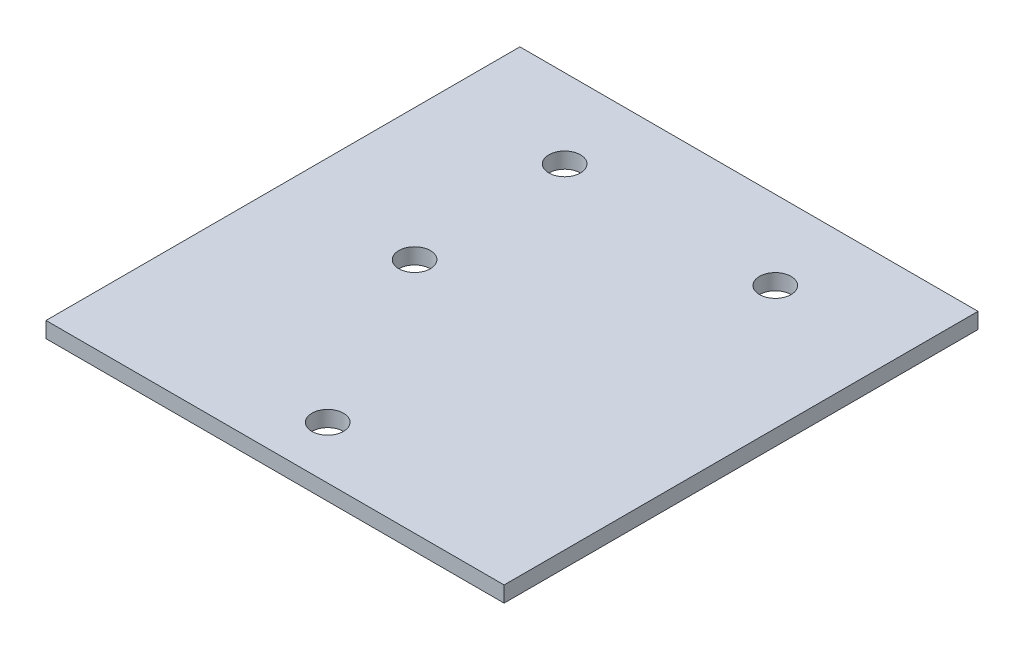
ISO-10303-21;
HEADER;
FILE_DESCRIPTION(('STEP AP214'),'2;1');
FILE_NAME('part.step','',(''),(''),'','','');
FILE_SCHEMA(('AUTOMOTIVE_DESIGN { 1 0 10303 214 1 1 1 1 }'));
ENDSEC;
DATA;
#1=APPLICATION_CONTEXT('core data for automotive mechanical design processes');
#2=APPLICATION_PROTOCOL_DEFINITION('international standard','automotive_design',2000,#1);
#3=PRODUCT_CONTEXT('',#1,'mechanical');
#4=PRODUCT('Part','Part','',(#3));
#5=PRODUCT_RELATED_PRODUCT_CATEGORY('part','',(#4));
#6=PRODUCT_DEFINITION_FORMATION('','',#4);
#7=PRODUCT_DEFINITION_CONTEXT('part definition',#1,'design');
#8=PRODUCT_DEFINITION('design','',#6,#7);
#9=PRODUCT_DEFINITION_SHAPE('','',#8);
#10=(LENGTH_UNIT() NAMED_UNIT(*) SI_UNIT(.MILLI.,.METRE.));
#11=(NAMED_UNIT(*) PLANE_ANGLE_UNIT() SI_UNIT($,.RADIAN.));
#12=(NAMED_UNIT(*) SI_UNIT($,.STERADIAN.) SOLID_ANGLE_UNIT());
#13=UNCERTAINTY_MEASURE_WITH_UNIT(LENGTH_MEASURE(1.E-05),#10,'distance_accuracy_value','');
#14=(GEOMETRIC_REPRESENTATION_CONTEXT(3) GLOBAL_UNCERTAINTY_ASSIGNED_CONTEXT((#13)) GLOBAL_UNIT_ASSIGNED_CONTEXT((#10,
#11,#12)) REPRESENTATION_CONTEXT('',''));
#15=CARTESIAN_POINT('',(0.,0.,0.));
#16=DIRECTION('',(0.,0.,1.));
#17=DIRECTION('',(1.,0.,0.));
#18=AXIS2_PLACEMENT_3D('',#15,#16,#17);
#19=CARTESIAN_POINT('',(43.5,3.,45.));
#20=DIRECTION('',(-1.,0.,0.));
#21=DIRECTION('',(0.,0.,1.));
#22=AXIS2_PLACEMENT_3D('',#19,#20,#21);
#23=PLANE('',#22);
#24=DIRECTION('',(0.,0.,-1.));
#25=VECTOR('',#24,1.);
#26=CARTESIAN_POINT('',(43.5,0.,45.));
#27=LINE('',#26,#25);
#28=CARTESIAN_POINT('',(43.5,0.,45.));
#29=VERTEX_POINT('',#28);
#30=CARTESIAN_POINT('',(43.5,0.,-45.));
#31=VERTEX_POINT('',#30);
#32=EDGE_CURVE('E108',#29,#31,#27,.T.);
#33=ORIENTED_EDGE('',*,*,#32,.T.);
#34=DIRECTION('',(0.,-1.,0.));
#35=VECTOR('',#34,1.);
#36=CARTESIAN_POINT('',(43.5,3.,-45.));
#37=LINE('',#36,#35);
#38=CARTESIAN_POINT('',(43.5,3.,-45.));
#39=VERTEX_POINT('',#38);
#40=EDGE_CURVE('E11',#39,#31,#37,.T.);
#41=ORIENTED_EDGE('',*,*,#40,.F.);
#42=DIRECTION('',(0.,0.,-1.));
#43=VECTOR('',#42,1.);
#44=CARTESIAN_POINT('',(43.5,3.,45.));
#45=LINE('',#44,#43);
#46=CARTESIAN_POINT('',(43.5,3.,45.));
#47=VERTEX_POINT('',#46);
#48=EDGE_CURVE('E96',#47,#39,#45,.T.);
#49=ORIENTED_EDGE('',*,*,#48,.F.);
#50=DIRECTION('',(0.,-1.,0.));
#51=VECTOR('',#50,1.);
#52=CARTESIAN_POINT('',(43.5,3.,45.));
#53=LINE('',#52,#51);
#54=EDGE_CURVE('E104',#47,#29,#53,.T.);
#55=ORIENTED_EDGE('',*,*,#54,.T.);
#56=EDGE_LOOP('',(#33,#41,#49,#55));
#57=FACE_BOUND('',#56,.T.);
#58=ADVANCED_FACE('F45',(#57),#23,.F.);
#59=CARTESIAN_POINT('',(-43.5,3.,-45.));
#60=DIRECTION('',(0.,0.,1.));
#61=DIRECTION('',(1.,0.,0.));
#62=AXIS2_PLACEMENT_3D('',#59,#60,#61);
#63=PLANE('',#62);
#64=DIRECTION('',(-1.,0.,0.));
#65=VECTOR('',#64,1.);
#66=CARTESIAN_POINT('',(-43.5,0.,-45.));
#67=LINE('',#66,#65);
#68=CARTESIAN_POINT('',(-43.5,0.,-45.));
#69=VERTEX_POINT('',#68);
#70=EDGE_CURVE('E100',#31,#69,#67,.T.);
#71=ORIENTED_EDGE('',*,*,#70,.T.);
#72=DIRECTION('',(0.,-1.,0.));
#73=VECTOR('',#72,1.);
#74=CARTESIAN_POINT('',(-43.5,3.,-45.));
#75=LINE('',#74,#73);
#76=CARTESIAN_POINT('',(-43.5,3.,-45.));
#77=VERTEX_POINT('',#76);
#78=EDGE_CURVE('E53',#77,#69,#75,.T.);
#79=ORIENTED_EDGE('',*,*,#78,.F.);
#80=DIRECTION('',(-1.,0.,0.));
#81=VECTOR('',#80,1.);
#82=CARTESIAN_POINT('',(-43.5,3.,-45.));
#83=LINE('',#82,#81);
#84=EDGE_CURVE('E91',#39,#77,#83,.T.);
#85=ORIENTED_EDGE('',*,*,#84,.F.);
#86=ORIENTED_EDGE('',*,*,#40,.T.);
#87=EDGE_LOOP('',(#71,#79,#85,#86));
#88=FACE_BOUND('',#87,.T.);
#89=ADVANCED_FACE('F99',(#88),#63,.F.);
#90=CARTESIAN_POINT('',(-43.5,3.,45.));
#91=DIRECTION('',(1.,0.,0.));
#92=DIRECTION('',(0.,0.,-1.));
#93=AXIS2_PLACEMENT_3D('',#90,#91,#92);
#94=PLANE('',#93);
#95=DIRECTION('',(0.,0.,1.));
#96=VECTOR('',#95,1.);
#97=CARTESIAN_POINT('',(-43.5,0.,45.));
#98=LINE('',#97,#96);
#99=CARTESIAN_POINT('',(-43.5,0.,45.));
#100=VERTEX_POINT('',#99);
#101=EDGE_CURVE('E78',#69,#100,#98,.T.);
#102=ORIENTED_EDGE('',*,*,#101,.T.);
#103=DIRECTION('',(0.,-1.,0.));
#104=VECTOR('',#103,1.);
#105=CARTESIAN_POINT('',(-43.5,3.,45.));
#106=LINE('',#105,#104);
#107=CARTESIAN_POINT('',(-43.5,3.,45.));
#108=VERTEX_POINT('',#107);
#109=EDGE_CURVE('E101',#108,#100,#106,.T.);
#110=ORIENTED_EDGE('',*,*,#109,.F.);
#111=DIRECTION('',(0.,0.,1.));
#112=VECTOR('',#111,1.);
#113=CARTESIAN_POINT('',(-43.5,3.,45.));
#114=LINE('',#113,#112);
#115=EDGE_CURVE('E94',#77,#108,#114,.T.);
#116=ORIENTED_EDGE('',*,*,#115,.F.);
#117=ORIENTED_EDGE('',*,*,#78,.T.);
#118=EDGE_LOOP('',(#102,#110,#116,#117));
#119=FACE_BOUND('',#118,.T.);
#120=ADVANCED_FACE('F102',(#119),#94,.F.);
#121=CARTESIAN_POINT('',(-43.5,3.,45.));
#122=DIRECTION('',(0.,0.,-1.));
#123=DIRECTION('',(-1.,0.,0.));
#124=AXIS2_PLACEMENT_3D('',#121,#122,#123);
#125=PLANE('',#124);
#126=DIRECTION('',(1.,0.,0.));
#127=VECTOR('',#126,1.);
#128=CARTESIAN_POINT('',(-43.5,0.,45.));
#129=LINE('',#128,#127);
#130=EDGE_CURVE('E84',#100,#29,#129,.T.);
#131=ORIENTED_EDGE('',*,*,#130,.T.);
#132=ORIENTED_EDGE('',*,*,#54,.F.);
#133=DIRECTION('',(1.,0.,0.));
#134=VECTOR('',#133,1.);
#135=CARTESIAN_POINT('',(-43.5,3.,45.));
#136=LINE('',#135,#134);
#137=EDGE_CURVE('E61',#108,#47,#136,.T.);
#138=ORIENTED_EDGE('',*,*,#137,.F.);
#139=ORIENTED_EDGE('',*,*,#109,.T.);
#140=EDGE_LOOP('',(#131,#132,#138,#139));
#141=FACE_BOUND('',#140,.T.);
#142=ADVANCED_FACE('F116',(#141),#125,.F.);
#143=CARTESIAN_POINT('',(0.,3.,0.));
#144=DIRECTION('',(0.,-1.,0.));
#145=DIRECTION('',(0.,0.,-1.));
#146=AXIS2_PLACEMENT_3D('',#143,#144,#145);
#147=PLANE('',#146);
#148=CARTESIAN_POINT('',(0.,3.,35.));
#149=DIRECTION('',(0.,-1.,0.));
#150=DIRECTION('',(0.,0.,-1.));
#151=AXIS2_PLACEMENT_3D('',#148,#149,#150);
#152=CIRCLE('',#151,3.);
#153=CARTESIAN_POINT('',(0.,3.,32.));
#154=VERTEX_POINT('',#153);
#155=EDGE_CURVE('E125',#154,#154,#152,.T.);
#156=ORIENTED_EDGE('',*,*,#155,.T.);
#157=EDGE_LOOP('',(#156));
#158=FACE_BOUND('',#157,.T.);
#159=CARTESIAN_POINT('',(-20.,3.,-30.));
#160=DIRECTION('',(0.,-1.,0.));
#161=DIRECTION('',(0.,0.,-1.));
#162=AXIS2_PLACEMENT_3D('',#159,#160,#161);
#163=CIRCLE('',#162,3.);
#164=CARTESIAN_POINT('',(-20.,3.,-33.));
#165=VERTEX_POINT('',#164);
#166=EDGE_CURVE('E134',#165,#165,#163,.T.);
#167=ORIENTED_EDGE('',*,*,#166,.T.);
#168=EDGE_LOOP('',(#167));
#169=FACE_BOUND('',#168,.T.);
#170=CARTESIAN_POINT('',(20.,3.,-30.));
#171=DIRECTION('',(0.,-1.,0.));
#172=DIRECTION('',(0.,0.,-1.));
#173=AXIS2_PLACEMENT_3D('',#170,#171,#172);
#174=CIRCLE('',#173,3.);
#175=CARTESIAN_POINT('',(20.,3.,-33.));
#176=VERTEX_POINT('',#175);
#177=EDGE_CURVE('E128',#176,#176,#174,.T.);
#178=ORIENTED_EDGE('',*,*,#177,.T.);
#179=EDGE_LOOP('',(#178));
#180=FACE_BOUND('',#179,.T.);
#181=CARTESIAN_POINT('',(-18.5,3.,0.));
#182=DIRECTION('',(0.,1.,0.));
#183=DIRECTION('',(0.,0.,1.));
#184=AXIS2_PLACEMENT_3D('',#181,#182,#183);
#185=CIRCLE('',#184,2.99999999999999);
#186=CARTESIAN_POINT('',(-18.5,3.,2.99999999999999));
#187=VERTEX_POINT('',#186);
#188=EDGE_CURVE('E122',#187,#187,#185,.T.);
#189=ORIENTED_EDGE('',*,*,#188,.F.);
#190=EDGE_LOOP('',(#189));
#191=FACE_BOUND('',#190,.T.);
#192=ORIENTED_EDGE('',*,*,#48,.T.);
#193=ORIENTED_EDGE('',*,*,#84,.T.);
#194=ORIENTED_EDGE('',*,*,#115,.T.);
#195=ORIENTED_EDGE('',*,*,#137,.T.);
#196=EDGE_LOOP('',(#192,#193,#194,#195));
#197=FACE_BOUND('',#196,.T.);
#198=ADVANCED_FACE('F92',(#158,#169,#180,#191,#197),#147,.F.);
#199=CARTESIAN_POINT('',(0.,0.,0.));
#200=DIRECTION('',(0.,-1.,0.));
#201=DIRECTION('',(0.,0.,-1.));
#202=AXIS2_PLACEMENT_3D('',#199,#200,#201);
#203=PLANE('',#202);
#204=CARTESIAN_POINT('',(0.,0.,35.));
#205=DIRECTION('',(0.,-1.,0.));
#206=DIRECTION('',(0.,0.,-1.));
#207=AXIS2_PLACEMENT_3D('',#204,#205,#206);
#208=CIRCLE('',#207,3.);
#209=CARTESIAN_POINT('',(0.,0.,32.));
#210=VERTEX_POINT('',#209);
#211=EDGE_CURVE('E140',#210,#210,#208,.T.);
#212=ORIENTED_EDGE('',*,*,#211,.F.);
#213=EDGE_LOOP('',(#212));
#214=FACE_BOUND('',#213,.T.);
#215=CARTESIAN_POINT('',(-20.,0.,-30.));
#216=DIRECTION('',(0.,-1.,0.));
#217=DIRECTION('',(0.,0.,-1.));
#218=AXIS2_PLACEMENT_3D('',#215,#216,#217);
#219=CIRCLE('',#218,3.);
#220=CARTESIAN_POINT('',(-20.,0.,-33.));
#221=VERTEX_POINT('',#220);
#222=EDGE_CURVE('E137',#221,#221,#219,.T.);
#223=ORIENTED_EDGE('',*,*,#222,.F.);
#224=EDGE_LOOP('',(#223));
#225=FACE_BOUND('',#224,.T.);
#226=CARTESIAN_POINT('',(20.,0.,-30.));
#227=DIRECTION('',(0.,-1.,0.));
#228=DIRECTION('',(0.,0.,-1.));
#229=AXIS2_PLACEMENT_3D('',#226,#227,#228);
#230=CIRCLE('',#229,3.);
#231=CARTESIAN_POINT('',(20.,0.,-33.));
#232=VERTEX_POINT('',#231);
#233=EDGE_CURVE('E131',#232,#232,#230,.T.);
#234=ORIENTED_EDGE('',*,*,#233,.F.);
#235=EDGE_LOOP('',(#234));
#236=FACE_BOUND('',#235,.T.);
#237=CARTESIAN_POINT('',(-18.5,0.,0.));
#238=DIRECTION('',(0.,1.,0.));
#239=DIRECTION('',(0.,0.,1.));
#240=AXIS2_PLACEMENT_3D('',#237,#238,#239);
#241=CIRCLE('',#240,2.99999999999999);
#242=CARTESIAN_POINT('',(-18.5,0.,2.99999999999999));
#243=VERTEX_POINT('',#242);
#244=EDGE_CURVE('E111',#243,#243,#241,.T.);
#245=ORIENTED_EDGE('',*,*,#244,.T.);
#246=EDGE_LOOP('',(#245));
#247=FACE_BOUND('',#246,.T.);
#248=ORIENTED_EDGE('',*,*,#32,.F.);
#249=ORIENTED_EDGE('',*,*,#130,.F.);
#250=ORIENTED_EDGE('',*,*,#101,.F.);
#251=ORIENTED_EDGE('',*,*,#70,.F.);
#252=EDGE_LOOP('',(#248,#249,#250,#251));
#253=FACE_BOUND('',#252,.T.);
#254=ADVANCED_FACE('F119',(#214,#225,#236,#247,#253),#203,.T.);
#255=CARTESIAN_POINT('',(-18.5,0.,0.));
#256=DIRECTION('',(0.,1.,0.));
#257=DIRECTION('',(0.,0.,1.));
#258=AXIS2_PLACEMENT_3D('',#255,#256,#257);
#259=CYLINDRICAL_SURFACE('',#258,2.99999999999999);
#260=ORIENTED_EDGE('',*,*,#244,.F.);
#261=EDGE_LOOP('',(#260));
#262=FACE_BOUND('',#261,.T.);
#263=ORIENTED_EDGE('',*,*,#188,.T.);
#264=EDGE_LOOP('',(#263));
#265=FACE_BOUND('',#264,.T.);
#266=ADVANCED_FACE('F157',(#262,#265),#259,.F.);
#267=CARTESIAN_POINT('',(20.,3.,-30.));
#268=DIRECTION('',(0.,-1.,0.));
#269=DIRECTION('',(0.,0.,-1.));
#270=AXIS2_PLACEMENT_3D('',#267,#268,#269);
#271=CYLINDRICAL_SURFACE('',#270,3.);
#272=ORIENTED_EDGE('',*,*,#177,.F.);
#273=EDGE_LOOP('',(#272));
#274=FACE_BOUND('',#273,.T.);
#275=ORIENTED_EDGE('',*,*,#233,.T.);
#276=EDGE_LOOP('',(#275));
#277=FACE_BOUND('',#276,.T.);
#278=ADVANCED_FACE('F167',(#274,#277),#271,.F.);
#279=CARTESIAN_POINT('',(-20.,3.,-30.));
#280=DIRECTION('',(0.,-1.,0.));
#281=DIRECTION('',(0.,0.,-1.));
#282=AXIS2_PLACEMENT_3D('',#279,#280,#281);
#283=CYLINDRICAL_SURFACE('',#282,3.);
#284=ORIENTED_EDGE('',*,*,#166,.F.);
#285=EDGE_LOOP('',(#284));
#286=FACE_BOUND('',#285,.T.);
#287=ORIENTED_EDGE('',*,*,#222,.T.);
#288=EDGE_LOOP('',(#287));
#289=FACE_BOUND('',#288,.T.);
#290=ADVANCED_FACE('F151',(#286,#289),#283,.F.);
#291=CARTESIAN_POINT('',(0.,3.,35.));
#292=DIRECTION('',(0.,-1.,0.));
#293=DIRECTION('',(0.,0.,-1.));
#294=AXIS2_PLACEMENT_3D('',#291,#292,#293);
#295=CYLINDRICAL_SURFACE('',#294,3.);
#296=ORIENTED_EDGE('',*,*,#155,.F.);
#297=EDGE_LOOP('',(#296));
#298=FACE_BOUND('',#297,.T.);
#299=ORIENTED_EDGE('',*,*,#211,.T.);
#300=EDGE_LOOP('',(#299));
#301=FACE_BOUND('',#300,.T.);
#302=ADVANCED_FACE('F148',(#298,#301),#295,.F.);
#303=CLOSED_SHELL('',(#58,#89,#120,#142,#198,#254,#266,#278,#290,#302));
#304=MANIFOLD_SOLID_BREP('B2',#303);
#305=ADVANCED_BREP_SHAPE_REPRESENTATION('',(#18,#304),#14);
#306=SHAPE_DEFINITION_REPRESENTATION(#9,#305);
ENDSEC;
END-ISO-10303-21;
